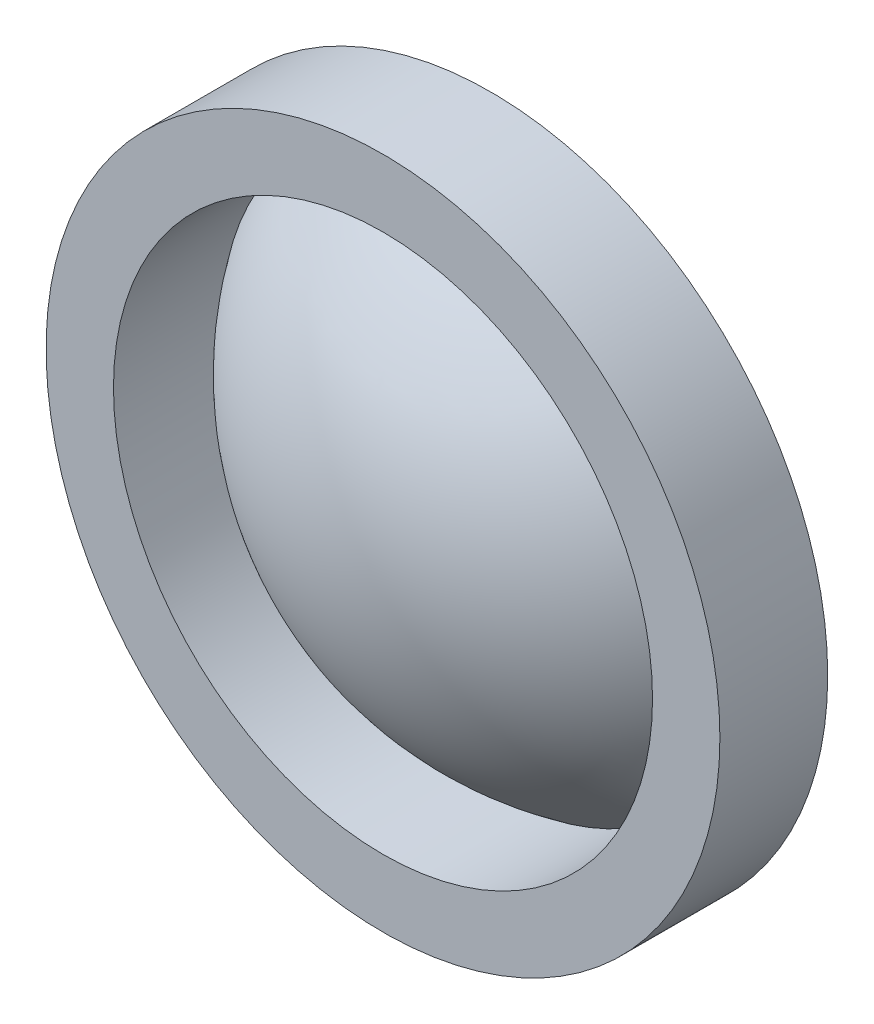
ISO-10303-21;
HEADER;
FILE_DESCRIPTION(('STEP AP214'),'2;1');
FILE_NAME('part.step','',(''),(''),'','','');
FILE_SCHEMA(('AUTOMOTIVE_DESIGN { 1 0 10303 214 1 1 1 1 }'));
ENDSEC;
DATA;
#1=APPLICATION_CONTEXT('core data for automotive mechanical design processes');
#2=APPLICATION_PROTOCOL_DEFINITION('international standard','automotive_design',2000,#1);
#3=PRODUCT_CONTEXT('',#1,'mechanical');
#4=PRODUCT('Part','Part','',(#3));
#5=PRODUCT_RELATED_PRODUCT_CATEGORY('part','',(#4));
#6=PRODUCT_DEFINITION_FORMATION('','',#4);
#7=PRODUCT_DEFINITION_CONTEXT('part definition',#1,'design');
#8=PRODUCT_DEFINITION('design','',#6,#7);
#9=PRODUCT_DEFINITION_SHAPE('','',#8);
#10=(LENGTH_UNIT() NAMED_UNIT(*) SI_UNIT(.MILLI.,.METRE.));
#11=(NAMED_UNIT(*) PLANE_ANGLE_UNIT() SI_UNIT($,.RADIAN.));
#12=(NAMED_UNIT(*) SI_UNIT($,.STERADIAN.) SOLID_ANGLE_UNIT());
#13=UNCERTAINTY_MEASURE_WITH_UNIT(LENGTH_MEASURE(1.E-05),#10,'distance_accuracy_value','');
#14=(GEOMETRIC_REPRESENTATION_CONTEXT(3) GLOBAL_UNCERTAINTY_ASSIGNED_CONTEXT((#13)) GLOBAL_UNIT_ASSIGNED_CONTEXT((#10,
#11,#12)) REPRESENTATION_CONTEXT('',''));
#15=CARTESIAN_POINT('',(0.,0.,0.));
#16=DIRECTION('',(0.,0.,1.));
#17=DIRECTION('',(1.,0.,0.));
#18=AXIS2_PLACEMENT_3D('',#15,#16,#17);
#19=CARTESIAN_POINT('',(0.,1.11022302462516E-13,-681.248853210044));
#20=DIRECTION('',(0.,0.,-1.));
#21=DIRECTION('',(0.,1.,0.));
#22=AXIS2_PLACEMENT_3D('',#19,#20,#21);
#23=SPHERICAL_SURFACE('',#22,1210.);
#24=CARTESIAN_POINT('',(0.,0.,0.));
#25=DIRECTION('',(0.,0.,-1.));
#26=DIRECTION('',(-1.,0.,0.));
#27=AXIS2_PLACEMENT_3D('',#24,#25,#26);
#28=CIRCLE('',#27,1000.);
#29=CARTESIAN_POINT('',(-1000.,0.,0.));
#30=VERTEX_POINT('',#29);
#31=EDGE_CURVE('E11',#30,#30,#28,.T.);
#32=ORIENTED_EDGE('',*,*,#31,.F.);
#33=EDGE_LOOP('',(#32));
#34=FACE_BOUND('',#33,.T.);
#35=ADVANCED_FACE('F51',(#34),#23,.T.);
#36=CARTESIAN_POINT('',(0.,0.,0.));
#37=DIRECTION('',(0.,0.,1.));
#38=DIRECTION('',(1.,0.,0.));
#39=AXIS2_PLACEMENT_3D('',#36,#37,#38);
#40=PLANE('',#39);
#41=ORIENTED_EDGE('',*,*,#31,.T.);
#42=EDGE_LOOP('',(#41));
#43=FACE_BOUND('',#42,.T.);
#44=ADVANCED_FACE('F58',(#43),#40,.F.);
#45=CLOSED_SHELL('',(#35,#44));
#46=MANIFOLD_SOLID_BREP('B2',#45);
#47=CARTESIAN_POINT('',(0.,0.,400.));
#48=DIRECTION('',(0.,0.,1.));
#49=DIRECTION('',(1.,0.,0.));
#50=AXIS2_PLACEMENT_3D('',#47,#48,#49);
#51=PLANE('',#50);
#52=CARTESIAN_POINT('',(0.,0.,400.));
#53=DIRECTION('',(0.,0.,1.));
#54=DIRECTION('',(1.,0.,0.));
#55=AXIS2_PLACEMENT_3D('',#52,#53,#54);
#56=CIRCLE('',#55,1250.);
#57=CARTESIAN_POINT('',(1250.,0.,400.));
#58=VERTEX_POINT('',#57);
#59=EDGE_CURVE('E50',#58,#58,#56,.T.);
#60=ORIENTED_EDGE('',*,*,#59,.T.);
#61=EDGE_LOOP('',(#60));
#62=FACE_BOUND('',#61,.T.);
#63=CARTESIAN_POINT('',(0.,0.,400.));
#64=DIRECTION('',(0.,0.,1.));
#65=DIRECTION('',(1.,0.,0.));
#66=AXIS2_PLACEMENT_3D('',#63,#64,#65);
#67=CIRCLE('',#66,1000.);
#68=CARTESIAN_POINT('',(1000.,0.,400.));
#69=VERTEX_POINT('',#68);
#70=EDGE_CURVE('E96',#69,#69,#67,.T.);
#71=ORIENTED_EDGE('',*,*,#70,.F.);
#72=EDGE_LOOP('',(#71));
#73=FACE_BOUND('',#72,.T.);
#74=ADVANCED_FACE('F85',(#62,#73),#51,.T.);
#75=CARTESIAN_POINT('',(0.,0.,0.));
#76=DIRECTION('',(0.,0.,1.));
#77=DIRECTION('',(1.,0.,0.));
#78=AXIS2_PLACEMENT_3D('',#75,#76,#77);
#79=PLANE('',#78);
#80=CARTESIAN_POINT('',(0.,0.,0.));
#81=DIRECTION('',(0.,0.,1.));
#82=DIRECTION('',(1.,0.,0.));
#83=AXIS2_PLACEMENT_3D('',#80,#81,#82);
#84=CIRCLE('',#83,1250.);
#85=CARTESIAN_POINT('',(1250.,0.,0.));
#86=VERTEX_POINT('',#85);
#87=EDGE_CURVE('E89',#86,#86,#84,.T.);
#88=ORIENTED_EDGE('',*,*,#87,.F.);
#89=EDGE_LOOP('',(#88));
#90=FACE_BOUND('',#89,.T.);
#91=CARTESIAN_POINT('',(0.,0.,0.));
#92=DIRECTION('',(0.,0.,1.));
#93=DIRECTION('',(1.,0.,0.));
#94=AXIS2_PLACEMENT_3D('',#91,#92,#93);
#95=CIRCLE('',#94,1000.);
#96=CARTESIAN_POINT('',(1000.,0.,0.));
#97=VERTEX_POINT('',#96);
#98=EDGE_CURVE('E98',#97,#97,#95,.T.);
#99=ORIENTED_EDGE('',*,*,#98,.T.);
#100=EDGE_LOOP('',(#99));
#101=FACE_BOUND('',#100,.T.);
#102=ADVANCED_FACE('F108',(#90,#101),#79,.F.);
#103=CARTESIAN_POINT('',(0.,0.,400.));
#104=DIRECTION('',(0.,0.,-1.));
#105=DIRECTION('',(-1.,0.,0.));
#106=AXIS2_PLACEMENT_3D('',#103,#104,#105);
#107=CYLINDRICAL_SURFACE('',#106,1250.);
#108=ORIENTED_EDGE('',*,*,#59,.F.);
#109=EDGE_LOOP('',(#108));
#110=FACE_BOUND('',#109,.T.);
#111=ORIENTED_EDGE('',*,*,#87,.T.);
#112=EDGE_LOOP('',(#111));
#113=FACE_BOUND('',#112,.T.);
#114=ADVANCED_FACE('F87',(#110,#113),#107,.T.);
#115=CARTESIAN_POINT('',(0.,0.,400.));
#116=DIRECTION('',(0.,0.,-1.));
#117=DIRECTION('',(-1.,0.,0.));
#118=AXIS2_PLACEMENT_3D('',#115,#116,#117);
#119=CYLINDRICAL_SURFACE('',#118,1000.);
#120=ORIENTED_EDGE('',*,*,#70,.T.);
#121=EDGE_LOOP('',(#120));
#122=FACE_BOUND('',#121,.T.);
#123=ORIENTED_EDGE('',*,*,#98,.F.);
#124=EDGE_LOOP('',(#123));
#125=FACE_BOUND('',#124,.T.);
#126=ADVANCED_FACE('F104',(#122,#125),#119,.F.);
#127=CLOSED_SHELL('',(#74,#102,#114,#126));
#128=MANIFOLD_SOLID_BREP('B6',#127);
#129=ADVANCED_BREP_SHAPE_REPRESENTATION('',(#18,#46,#128),#14);
#130=SHAPE_DEFINITION_REPRESENTATION(#9,#129);
ENDSEC;
END-ISO-10303-21;
